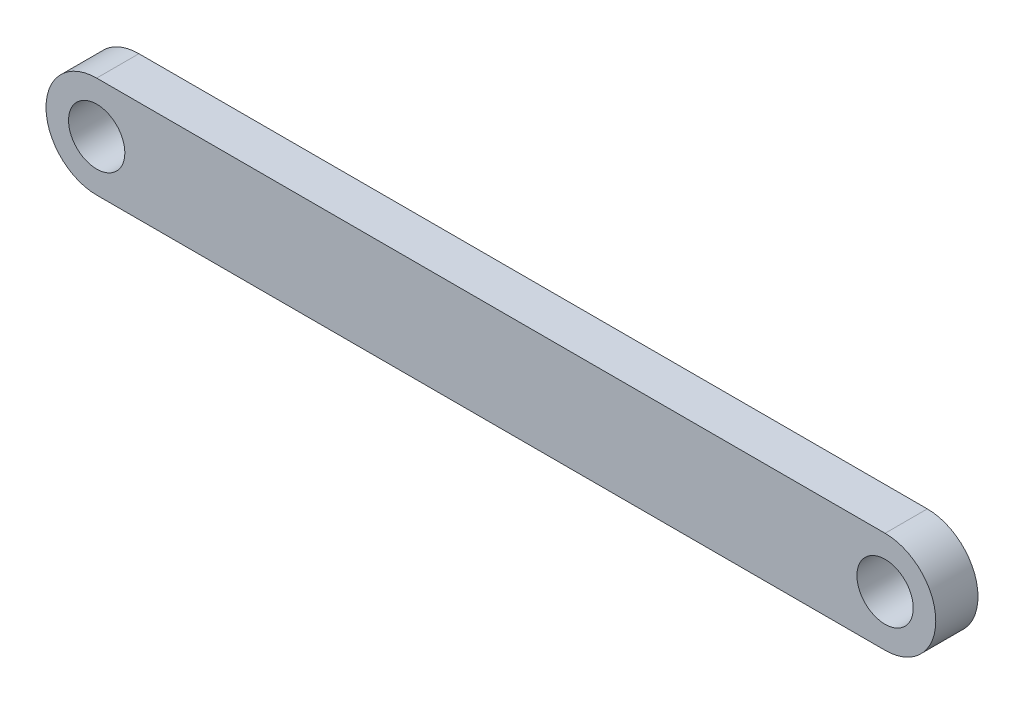
ISO-10303-21;
HEADER;
FILE_DESCRIPTION(('STEP AP214'),'2;1');
FILE_NAME('part.step','',(''),(''),'','','');
FILE_SCHEMA(('AUTOMOTIVE_DESIGN { 1 0 10303 214 1 1 1 1 }'));
ENDSEC;
DATA;
#1=APPLICATION_CONTEXT('core data for automotive mechanical design processes');
#2=APPLICATION_PROTOCOL_DEFINITION('international standard','automotive_design',2000,#1);
#3=PRODUCT_CONTEXT('',#1,'mechanical');
#4=PRODUCT('Part','Part','',(#3));
#5=PRODUCT_RELATED_PRODUCT_CATEGORY('part','',(#4));
#6=PRODUCT_DEFINITION_FORMATION('','',#4);
#7=PRODUCT_DEFINITION_CONTEXT('part definition',#1,'design');
#8=PRODUCT_DEFINITION('design','',#6,#7);
#9=PRODUCT_DEFINITION_SHAPE('','',#8);
#10=(LENGTH_UNIT() NAMED_UNIT(*) SI_UNIT(.MILLI.,.METRE.));
#11=(NAMED_UNIT(*) PLANE_ANGLE_UNIT() SI_UNIT($,.RADIAN.));
#12=(NAMED_UNIT(*) SI_UNIT($,.STERADIAN.) SOLID_ANGLE_UNIT());
#13=UNCERTAINTY_MEASURE_WITH_UNIT(LENGTH_MEASURE(1.E-05),#10,'distance_accuracy_value','');
#14=(GEOMETRIC_REPRESENTATION_CONTEXT(3) GLOBAL_UNCERTAINTY_ASSIGNED_CONTEXT((#13)) GLOBAL_UNIT_ASSIGNED_CONTEXT((#10,
#11,#12)) REPRESENTATION_CONTEXT('',''));
#15=CARTESIAN_POINT('',(0.,0.,0.));
#16=DIRECTION('',(0.,0.,1.));
#17=DIRECTION('',(1.,0.,0.));
#18=AXIS2_PLACEMENT_3D('',#15,#16,#17);
#19=CARTESIAN_POINT('',(-71.1743772594618,0.,15.));
#20=DIRECTION('',(0.,0.,-1.));
#21=DIRECTION('',(-1.,0.,0.));
#22=AXIS2_PLACEMENT_3D('',#19,#20,#21);
#23=PLANE('',#22);
#24=CARTESIAN_POINT('',(-71.1743772594618,0.,15.));
#25=DIRECTION('',(0.,0.,1.));
#26=DIRECTION('',(1.,0.,0.));
#27=AXIS2_PLACEMENT_3D('',#24,#25,#26);
#28=CIRCLE('',#27,10.);
#29=CARTESIAN_POINT('',(-61.1743772594618,0.,15.));
#30=VERTEX_POINT('',#29);
#31=EDGE_CURVE('E99',#30,#30,#28,.T.);
#32=ORIENTED_EDGE('',*,*,#31,.F.);
#33=EDGE_LOOP('',(#32));
#34=FACE_BOUND('',#33,.T.);
#35=CARTESIAN_POINT('',(-71.1743772594618,0.,15.));
#36=DIRECTION('',(0.,0.,1.));
#37=DIRECTION('',(-1.,0.,0.));
#38=AXIS2_PLACEMENT_3D('',#35,#36,#37);
#39=CIRCLE('',#38,18.);
#40=CARTESIAN_POINT('',(-71.1743772594618,18.,15.));
#41=VERTEX_POINT('',#40);
#42=CARTESIAN_POINT('',(-71.1743772594618,-18.,15.));
#43=VERTEX_POINT('',#42);
#44=EDGE_CURVE('E84',#41,#43,#39,.T.);
#45=ORIENTED_EDGE('',*,*,#44,.T.);
#46=DIRECTION('',(1.,0.,0.));
#47=VECTOR('',#46,1.);
#48=CARTESIAN_POINT('',(-71.1743772594618,-18.,15.));
#49=LINE('',#48,#47);
#50=CARTESIAN_POINT('',(208.825622740538,-18.,15.));
#51=VERTEX_POINT('',#50);
#52=EDGE_CURVE('E79',#43,#51,#49,.T.);
#53=ORIENTED_EDGE('',*,*,#52,.T.);
#54=CARTESIAN_POINT('',(208.825622740538,0.,15.));
#55=DIRECTION('',(0.,0.,1.));
#56=DIRECTION('',(-1.,0.,0.));
#57=AXIS2_PLACEMENT_3D('',#54,#55,#56);
#58=CIRCLE('',#57,18.);
#59=CARTESIAN_POINT('',(208.825622740538,18.,15.));
#60=VERTEX_POINT('',#59);
#61=EDGE_CURVE('E82',#51,#60,#58,.T.);
#62=ORIENTED_EDGE('',*,*,#61,.T.);
#63=DIRECTION('',(-1.,0.,0.));
#64=VECTOR('',#63,1.);
#65=CARTESIAN_POINT('',(-71.1743772594618,18.,15.));
#66=LINE('',#65,#64);
#67=EDGE_CURVE('E49',#60,#41,#66,.T.);
#68=ORIENTED_EDGE('',*,*,#67,.T.);
#69=EDGE_LOOP('',(#45,#53,#62,#68));
#70=FACE_BOUND('',#69,.T.);
#71=CARTESIAN_POINT('',(208.825622740538,0.,15.));
#72=DIRECTION('',(0.,0.,1.));
#73=DIRECTION('',(1.,0.,0.));
#74=AXIS2_PLACEMENT_3D('',#71,#72,#73);
#75=CIRCLE('',#74,10.);
#76=CARTESIAN_POINT('',(218.825622740538,0.,15.));
#77=VERTEX_POINT('',#76);
#78=EDGE_CURVE('E114',#77,#77,#75,.T.);
#79=ORIENTED_EDGE('',*,*,#78,.F.);
#80=EDGE_LOOP('',(#79));
#81=FACE_BOUND('',#80,.T.);
#82=ADVANCED_FACE('F32',(#34,#70,#81),#23,.F.);
#83=CARTESIAN_POINT('',(-71.1743772594618,0.,0.));
#84=DIRECTION('',(0.,0.,-1.));
#85=DIRECTION('',(-1.,0.,0.));
#86=AXIS2_PLACEMENT_3D('',#83,#84,#85);
#87=PLANE('',#86);
#88=CARTESIAN_POINT('',(-71.1743772594618,0.,0.));
#89=DIRECTION('',(0.,0.,1.));
#90=DIRECTION('',(1.,0.,0.));
#91=AXIS2_PLACEMENT_3D('',#88,#89,#90);
#92=CIRCLE('',#91,10.);
#93=CARTESIAN_POINT('',(-61.1743772594618,0.,0.));
#94=VERTEX_POINT('',#93);
#95=EDGE_CURVE('E111',#94,#94,#92,.T.);
#96=ORIENTED_EDGE('',*,*,#95,.T.);
#97=EDGE_LOOP('',(#96));
#98=FACE_BOUND('',#97,.T.);
#99=CARTESIAN_POINT('',(-71.1743772594618,0.,0.));
#100=DIRECTION('',(0.,0.,1.));
#101=DIRECTION('',(-1.,0.,0.));
#102=AXIS2_PLACEMENT_3D('',#99,#100,#101);
#103=CIRCLE('',#102,18.);
#104=CARTESIAN_POINT('',(-71.1743772594618,18.,0.));
#105=VERTEX_POINT('',#104);
#106=CARTESIAN_POINT('',(-71.1743772594618,-18.,0.));
#107=VERTEX_POINT('',#106);
#108=EDGE_CURVE('E96',#105,#107,#103,.T.);
#109=ORIENTED_EDGE('',*,*,#108,.F.);
#110=DIRECTION('',(-1.,0.,0.));
#111=VECTOR('',#110,1.);
#112=CARTESIAN_POINT('',(-71.1743772594618,18.,0.));
#113=LINE('',#112,#111);
#114=CARTESIAN_POINT('',(208.825622740538,18.,0.));
#115=VERTEX_POINT('',#114);
#116=EDGE_CURVE('E72',#115,#105,#113,.T.);
#117=ORIENTED_EDGE('',*,*,#116,.F.);
#118=CARTESIAN_POINT('',(208.825622740538,0.,0.));
#119=DIRECTION('',(0.,0.,1.));
#120=DIRECTION('',(-1.,0.,0.));
#121=AXIS2_PLACEMENT_3D('',#118,#119,#120);
#122=CIRCLE('',#121,18.);
#123=CARTESIAN_POINT('',(208.825622740538,-18.,0.));
#124=VERTEX_POINT('',#123);
#125=EDGE_CURVE('E66',#124,#115,#122,.T.);
#126=ORIENTED_EDGE('',*,*,#125,.F.);
#127=DIRECTION('',(1.,0.,0.));
#128=VECTOR('',#127,1.);
#129=CARTESIAN_POINT('',(-71.1743772594618,-18.,0.));
#130=LINE('',#129,#128);
#131=EDGE_CURVE('E88',#107,#124,#130,.T.);
#132=ORIENTED_EDGE('',*,*,#131,.F.);
#133=EDGE_LOOP('',(#109,#117,#126,#132));
#134=FACE_BOUND('',#133,.T.);
#135=CARTESIAN_POINT('',(208.825622740538,0.,0.));
#136=DIRECTION('',(0.,0.,1.));
#137=DIRECTION('',(1.,0.,0.));
#138=AXIS2_PLACEMENT_3D('',#135,#136,#137);
#139=CIRCLE('',#138,10.);
#140=CARTESIAN_POINT('',(218.825622740538,0.,0.));
#141=VERTEX_POINT('',#140);
#142=EDGE_CURVE('E117',#141,#141,#139,.T.);
#143=ORIENTED_EDGE('',*,*,#142,.T.);
#144=EDGE_LOOP('',(#143));
#145=FACE_BOUND('',#144,.T.);
#146=ADVANCED_FACE('F107',(#98,#134,#145),#87,.T.);
#147=CARTESIAN_POINT('',(-71.1743772594618,0.,15.));
#148=DIRECTION('',(0.,0.,-1.));
#149=DIRECTION('',(-1.,0.,0.));
#150=AXIS2_PLACEMENT_3D('',#147,#148,#149);
#151=CYLINDRICAL_SURFACE('',#150,18.);
#152=ORIENTED_EDGE('',*,*,#108,.T.);
#153=DIRECTION('',(0.,0.,-1.));
#154=VECTOR('',#153,1.);
#155=CARTESIAN_POINT('',(-71.1743772594618,-18.,15.));
#156=LINE('',#155,#154);
#157=EDGE_CURVE('E11',#43,#107,#156,.T.);
#158=ORIENTED_EDGE('',*,*,#157,.F.);
#159=ORIENTED_EDGE('',*,*,#44,.F.);
#160=DIRECTION('',(0.,0.,-1.));
#161=VECTOR('',#160,1.);
#162=CARTESIAN_POINT('',(-71.1743772594618,18.,15.));
#163=LINE('',#162,#161);
#164=EDGE_CURVE('E92',#41,#105,#163,.T.);
#165=ORIENTED_EDGE('',*,*,#164,.T.);
#166=EDGE_LOOP('',(#152,#158,#159,#165));
#167=FACE_BOUND('',#166,.T.);
#168=ADVANCED_FACE('F34',(#167),#151,.T.);
#169=CARTESIAN_POINT('',(-71.1743772594618,-18.,15.));
#170=DIRECTION('',(0.,1.,0.));
#171=DIRECTION('',(0.,0.,1.));
#172=AXIS2_PLACEMENT_3D('',#169,#170,#171);
#173=PLANE('',#172);
#174=ORIENTED_EDGE('',*,*,#131,.T.);
#175=DIRECTION('',(0.,0.,-1.));
#176=VECTOR('',#175,1.);
#177=CARTESIAN_POINT('',(208.825622740538,-18.,15.));
#178=LINE('',#177,#176);
#179=EDGE_CURVE('E41',#51,#124,#178,.T.);
#180=ORIENTED_EDGE('',*,*,#179,.F.);
#181=ORIENTED_EDGE('',*,*,#52,.F.);
#182=ORIENTED_EDGE('',*,*,#157,.T.);
#183=EDGE_LOOP('',(#174,#180,#181,#182));
#184=FACE_BOUND('',#183,.T.);
#185=ADVANCED_FACE('F87',(#184),#173,.F.);
#186=CARTESIAN_POINT('',(208.825622740538,0.,15.));
#187=DIRECTION('',(0.,0.,-1.));
#188=DIRECTION('',(-1.,0.,0.));
#189=AXIS2_PLACEMENT_3D('',#186,#187,#188);
#190=CYLINDRICAL_SURFACE('',#189,18.);
#191=ORIENTED_EDGE('',*,*,#125,.T.);
#192=DIRECTION('',(0.,0.,-1.));
#193=VECTOR('',#192,1.);
#194=CARTESIAN_POINT('',(208.825622740538,18.,15.));
#195=LINE('',#194,#193);
#196=EDGE_CURVE('E89',#60,#115,#195,.T.);
#197=ORIENTED_EDGE('',*,*,#196,.F.);
#198=ORIENTED_EDGE('',*,*,#61,.F.);
#199=ORIENTED_EDGE('',*,*,#179,.T.);
#200=EDGE_LOOP('',(#191,#197,#198,#199));
#201=FACE_BOUND('',#200,.T.);
#202=ADVANCED_FACE('F90',(#201),#190,.T.);
#203=CARTESIAN_POINT('',(-71.1743772594618,18.,15.));
#204=DIRECTION('',(0.,-1.,0.));
#205=DIRECTION('',(0.,0.,-1.));
#206=AXIS2_PLACEMENT_3D('',#203,#204,#205);
#207=PLANE('',#206);
#208=ORIENTED_EDGE('',*,*,#116,.T.);
#209=ORIENTED_EDGE('',*,*,#164,.F.);
#210=ORIENTED_EDGE('',*,*,#67,.F.);
#211=ORIENTED_EDGE('',*,*,#196,.T.);
#212=EDGE_LOOP('',(#208,#209,#210,#211));
#213=FACE_BOUND('',#212,.T.);
#214=ADVANCED_FACE('F104',(#213),#207,.F.);
#215=CARTESIAN_POINT('',(-71.1743772594618,0.,15.));
#216=DIRECTION('',(0.,0.,-1.));
#217=DIRECTION('',(-1.,0.,0.));
#218=AXIS2_PLACEMENT_3D('',#215,#216,#217);
#219=CYLINDRICAL_SURFACE('',#218,10.);
#220=ORIENTED_EDGE('',*,*,#31,.T.);
#221=EDGE_LOOP('',(#220));
#222=FACE_BOUND('',#221,.T.);
#223=ORIENTED_EDGE('',*,*,#95,.F.);
#224=EDGE_LOOP('',(#223));
#225=FACE_BOUND('',#224,.T.);
#226=ADVANCED_FACE('F135',(#222,#225),#219,.F.);
#227=CARTESIAN_POINT('',(208.825622740538,0.,15.));
#228=DIRECTION('',(0.,0.,-1.));
#229=DIRECTION('',(-1.,0.,0.));
#230=AXIS2_PLACEMENT_3D('',#227,#228,#229);
#231=CYLINDRICAL_SURFACE('',#230,10.);
#232=ORIENTED_EDGE('',*,*,#78,.T.);
#233=EDGE_LOOP('',(#232));
#234=FACE_BOUND('',#233,.T.);
#235=ORIENTED_EDGE('',*,*,#142,.F.);
#236=EDGE_LOOP('',(#235));
#237=FACE_BOUND('',#236,.T.);
#238=ADVANCED_FACE('F123',(#234,#237),#231,.F.);
#239=CLOSED_SHELL('',(#82,#146,#168,#185,#202,#214,#226,#238));
#240=MANIFOLD_SOLID_BREP('B2',#239);
#241=ADVANCED_BREP_SHAPE_REPRESENTATION('',(#18,#240),#14);
#242=SHAPE_DEFINITION_REPRESENTATION(#9,#241);
ENDSEC;
END-ISO-10303-21;
